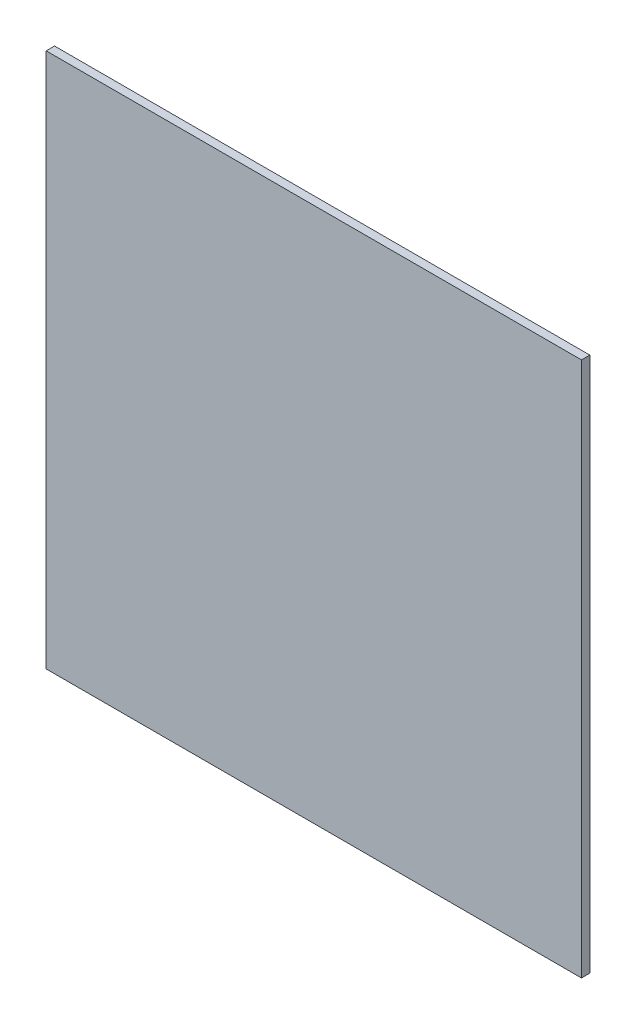
ISO-10303-21;
HEADER;
FILE_DESCRIPTION(('STEP AP214'),'2;1');
FILE_NAME('part.step','',(''),(''),'','','');
FILE_SCHEMA(('AUTOMOTIVE_DESIGN { 1 0 10303 214 1 1 1 1 }'));
ENDSEC;
DATA;
#1=APPLICATION_CONTEXT('core data for automotive mechanical design processes');
#2=APPLICATION_PROTOCOL_DEFINITION('international standard','automotive_design',2000,#1);
#3=PRODUCT_CONTEXT('',#1,'mechanical');
#4=PRODUCT('Part','Part','',(#3));
#5=PRODUCT_RELATED_PRODUCT_CATEGORY('part','',(#4));
#6=PRODUCT_DEFINITION_FORMATION('','',#4);
#7=PRODUCT_DEFINITION_CONTEXT('part definition',#1,'design');
#8=PRODUCT_DEFINITION('design','',#6,#7);
#9=PRODUCT_DEFINITION_SHAPE('','',#8);
#10=(LENGTH_UNIT() NAMED_UNIT(*) SI_UNIT(.MILLI.,.METRE.));
#11=(NAMED_UNIT(*) PLANE_ANGLE_UNIT() SI_UNIT($,.RADIAN.));
#12=(NAMED_UNIT(*) SI_UNIT($,.STERADIAN.) SOLID_ANGLE_UNIT());
#13=UNCERTAINTY_MEASURE_WITH_UNIT(LENGTH_MEASURE(1.E-05),#10,'distance_accuracy_value','');
#14=(GEOMETRIC_REPRESENTATION_CONTEXT(3) GLOBAL_UNCERTAINTY_ASSIGNED_CONTEXT((#13)) GLOBAL_UNIT_ASSIGNED_CONTEXT((#10,
#11,#12)) REPRESENTATION_CONTEXT('',''));
#15=CARTESIAN_POINT('',(0.,0.,0.));
#16=DIRECTION('',(0.,0.,1.));
#17=DIRECTION('',(1.,0.,0.));
#18=AXIS2_PLACEMENT_3D('',#15,#16,#17);
#19=CARTESIAN_POINT('',(-609.6,609.6,0.));
#20=DIRECTION('',(-1.,0.,0.));
#21=DIRECTION('',(0.,-1.,0.));
#22=AXIS2_PLACEMENT_3D('',#19,#20,#21);
#23=PLANE('',#22);
#24=DIRECTION('',(0.,-1.,0.));
#25=VECTOR('',#24,1.);
#26=CARTESIAN_POINT('',(-609.6,609.6,19.05));
#27=LINE('',#26,#25);
#28=CARTESIAN_POINT('',(-609.6,609.6,19.05));
#29=VERTEX_POINT('',#28);
#30=CARTESIAN_POINT('',(-609.6,-609.6,19.05));
#31=VERTEX_POINT('',#30);
#32=EDGE_CURVE('E106',#29,#31,#27,.T.);
#33=ORIENTED_EDGE('',*,*,#32,.F.);
#34=DIRECTION('',(0.,0.,1.));
#35=VECTOR('',#34,1.);
#36=CARTESIAN_POINT('',(-609.6,609.6,0.));
#37=LINE('',#36,#35);
#38=CARTESIAN_POINT('',(-609.6,609.6,0.));
#39=VERTEX_POINT('',#38);
#40=EDGE_CURVE('E12',#39,#29,#37,.T.);
#41=ORIENTED_EDGE('',*,*,#40,.F.);
#42=DIRECTION('',(0.,-1.,0.));
#43=VECTOR('',#42,1.);
#44=CARTESIAN_POINT('',(-609.6,609.6,0.));
#45=LINE('',#44,#43);
#46=CARTESIAN_POINT('',(-609.6,-609.6,0.));
#47=VERTEX_POINT('',#46);
#48=EDGE_CURVE('E100',#39,#47,#45,.T.);
#49=ORIENTED_EDGE('',*,*,#48,.T.);
#50=DIRECTION('',(0.,0.,1.));
#51=VECTOR('',#50,1.);
#52=CARTESIAN_POINT('',(-609.6,-609.6,0.));
#53=LINE('',#52,#51);
#54=EDGE_CURVE('E45',#47,#31,#53,.T.);
#55=ORIENTED_EDGE('',*,*,#54,.T.);
#56=EDGE_LOOP('',(#33,#41,#49,#55));
#57=FACE_BOUND('',#56,.T.);
#58=ADVANCED_FACE('F42',(#57),#23,.T.);
#59=CARTESIAN_POINT('',(609.6,609.6,0.));
#60=DIRECTION('',(0.,1.,0.));
#61=DIRECTION('',(-1.,0.,0.));
#62=AXIS2_PLACEMENT_3D('',#59,#60,#61);
#63=PLANE('',#62);
#64=DIRECTION('',(-1.,0.,0.));
#65=VECTOR('',#64,1.);
#66=CARTESIAN_POINT('',(609.6,609.6,19.05));
#67=LINE('',#66,#65);
#68=CARTESIAN_POINT('',(609.6,609.6,19.05));
#69=VERTEX_POINT('',#68);
#70=EDGE_CURVE('E102',#69,#29,#67,.T.);
#71=ORIENTED_EDGE('',*,*,#70,.F.);
#72=DIRECTION('',(0.,0.,1.));
#73=VECTOR('',#72,1.);
#74=CARTESIAN_POINT('',(609.6,609.6,0.));
#75=LINE('',#74,#73);
#76=CARTESIAN_POINT('',(609.6,609.6,0.));
#77=VERTEX_POINT('',#76);
#78=EDGE_CURVE('E51',#77,#69,#75,.T.);
#79=ORIENTED_EDGE('',*,*,#78,.F.);
#80=DIRECTION('',(-1.,0.,0.));
#81=VECTOR('',#80,1.);
#82=CARTESIAN_POINT('',(609.6,609.6,0.));
#83=LINE('',#82,#81);
#84=EDGE_CURVE('E97',#77,#39,#83,.T.);
#85=ORIENTED_EDGE('',*,*,#84,.T.);
#86=ORIENTED_EDGE('',*,*,#40,.T.);
#87=EDGE_LOOP('',(#71,#79,#85,#86));
#88=FACE_BOUND('',#87,.T.);
#89=ADVANCED_FACE('F116',(#88),#63,.T.);
#90=CARTESIAN_POINT('',(609.6,609.6,0.));
#91=DIRECTION('',(1.,0.,0.));
#92=DIRECTION('',(0.,1.,0.));
#93=AXIS2_PLACEMENT_3D('',#90,#91,#92);
#94=PLANE('',#93);
#95=DIRECTION('',(0.,1.,0.));
#96=VECTOR('',#95,1.);
#97=CARTESIAN_POINT('',(609.6,609.6,19.05));
#98=LINE('',#97,#96);
#99=CARTESIAN_POINT('',(609.6,-609.6,19.05));
#100=VERTEX_POINT('',#99);
#101=EDGE_CURVE('E92',#100,#69,#98,.T.);
#102=ORIENTED_EDGE('',*,*,#101,.F.);
#103=DIRECTION('',(0.,0.,1.));
#104=VECTOR('',#103,1.);
#105=CARTESIAN_POINT('',(609.6,-609.6,0.));
#106=LINE('',#105,#104);
#107=CARTESIAN_POINT('',(609.6,-609.6,0.));
#108=VERTEX_POINT('',#107);
#109=EDGE_CURVE('E87',#108,#100,#106,.T.);
#110=ORIENTED_EDGE('',*,*,#109,.F.);
#111=DIRECTION('',(0.,1.,0.));
#112=VECTOR('',#111,1.);
#113=CARTESIAN_POINT('',(609.6,609.6,0.));
#114=LINE('',#113,#112);
#115=EDGE_CURVE('E90',#108,#77,#114,.T.);
#116=ORIENTED_EDGE('',*,*,#115,.T.);
#117=ORIENTED_EDGE('',*,*,#78,.T.);
#118=EDGE_LOOP('',(#102,#110,#116,#117));
#119=FACE_BOUND('',#118,.T.);
#120=ADVANCED_FACE('F89',(#119),#94,.T.);
#121=CARTESIAN_POINT('',(609.6,-609.6,0.));
#122=DIRECTION('',(0.,-1.,0.));
#123=DIRECTION('',(0.,0.,-1.));
#124=AXIS2_PLACEMENT_3D('',#121,#122,#123);
#125=PLANE('',#124);
#126=DIRECTION('',(1.,0.,0.));
#127=VECTOR('',#126,1.);
#128=CARTESIAN_POINT('',(609.6,-609.6,19.05));
#129=LINE('',#128,#127);
#130=EDGE_CURVE('E109',#31,#100,#129,.T.);
#131=ORIENTED_EDGE('',*,*,#130,.F.);
#132=ORIENTED_EDGE('',*,*,#54,.F.);
#133=DIRECTION('',(1.,0.,0.));
#134=VECTOR('',#133,1.);
#135=CARTESIAN_POINT('',(609.6,-609.6,0.));
#136=LINE('',#135,#134);
#137=EDGE_CURVE('E96',#47,#108,#136,.T.);
#138=ORIENTED_EDGE('',*,*,#137,.T.);
#139=ORIENTED_EDGE('',*,*,#109,.T.);
#140=EDGE_LOOP('',(#131,#132,#138,#139));
#141=FACE_BOUND('',#140,.T.);
#142=ADVANCED_FACE('F99',(#141),#125,.T.);
#143=CARTESIAN_POINT('',(0.,0.,0.));
#144=DIRECTION('',(0.,0.,-1.));
#145=DIRECTION('',(-1.,0.,0.));
#146=AXIS2_PLACEMENT_3D('',#143,#144,#145);
#147=PLANE('',#146);
#148=ORIENTED_EDGE('',*,*,#48,.F.);
#149=ORIENTED_EDGE('',*,*,#84,.F.);
#150=ORIENTED_EDGE('',*,*,#115,.F.);
#151=ORIENTED_EDGE('',*,*,#137,.F.);
#152=EDGE_LOOP('',(#148,#149,#150,#151));
#153=FACE_BOUND('',#152,.T.);
#154=ADVANCED_FACE('F95',(#153),#147,.T.);
#155=CARTESIAN_POINT('',(0.,0.,19.05));
#156=DIRECTION('',(0.,0.,-1.));
#157=DIRECTION('',(-1.,0.,0.));
#158=AXIS2_PLACEMENT_3D('',#155,#156,#157);
#159=PLANE('',#158);
#160=ORIENTED_EDGE('',*,*,#32,.T.);
#161=ORIENTED_EDGE('',*,*,#130,.T.);
#162=ORIENTED_EDGE('',*,*,#101,.T.);
#163=ORIENTED_EDGE('',*,*,#70,.T.);
#164=EDGE_LOOP('',(#160,#161,#162,#163));
#165=FACE_BOUND('',#164,.T.);
#166=ADVANCED_FACE('F115',(#165),#159,.F.);
#167=CLOSED_SHELL('',(#58,#89,#120,#142,#154,#166));
#168=MANIFOLD_SOLID_BREP('B2',#167);
#169=CARTESIAN_POINT('',(0.,0.,19.05));
#170=DIRECTION('',(0.,0.,1.));
#171=DIRECTION('',(1.,0.,0.));
#172=AXIS2_PLACEMENT_3D('',#169,#170,#171);
#173=PLANE('',#172);
#174=CARTESIAN_POINT('',(0.,0.,19.05));
#175=DIRECTION('',(0.,0.,1.));
#176=DIRECTION('',(1.,0.,0.));
#177=AXIS2_PLACEMENT_3D('',#174,#175,#176);
#178=CIRCLE('',#177,584.2);
#179=CARTESIAN_POINT('',(-584.2,0.,19.05));
#180=VERTEX_POINT('',#179);
#181=EDGE_CURVE('E41',#180,#180,#178,.T.);
#182=ORIENTED_EDGE('',*,*,#181,.T.);
#183=EDGE_LOOP('',(#182));
#184=FACE_BOUND('',#183,.T.);
#185=CARTESIAN_POINT('',(0.,0.,19.05));
#186=DIRECTION('',(0.,0.,1.));
#187=DIRECTION('',(1.,0.,0.));
#188=AXIS2_PLACEMENT_3D('',#185,#186,#187);
#189=CIRCLE('',#188,533.4);
#190=CARTESIAN_POINT('',(-533.4,0.,19.05));
#191=VERTEX_POINT('',#190);
#192=EDGE_CURVE('E176',#191,#191,#189,.T.);
#193=ORIENTED_EDGE('',*,*,#192,.F.);
#194=EDGE_LOOP('',(#193));
#195=FACE_BOUND('',#194,.T.);
#196=ADVANCED_FACE('F165',(#184,#195),#173,.T.);
#197=CARTESIAN_POINT('',(0.,0.,0.));
#198=DIRECTION('',(0.,0.,1.));
#199=DIRECTION('',(1.,0.,0.));
#200=AXIS2_PLACEMENT_3D('',#197,#198,#199);
#201=PLANE('',#200);
#202=CARTESIAN_POINT('',(0.,0.,0.));
#203=DIRECTION('',(0.,0.,1.));
#204=DIRECTION('',(1.,0.,0.));
#205=AXIS2_PLACEMENT_3D('',#202,#203,#204);
#206=CIRCLE('',#205,584.2);
#207=CARTESIAN_POINT('',(-584.2,0.,0.));
#208=VERTEX_POINT('',#207);
#209=EDGE_CURVE('E169',#208,#208,#206,.T.);
#210=ORIENTED_EDGE('',*,*,#209,.F.);
#211=EDGE_LOOP('',(#210));
#212=FACE_BOUND('',#211,.T.);
#213=CARTESIAN_POINT('',(0.,0.,0.));
#214=DIRECTION('',(0.,0.,1.));
#215=DIRECTION('',(1.,0.,0.));
#216=AXIS2_PLACEMENT_3D('',#213,#214,#215);
#217=CIRCLE('',#216,533.4);
#218=CARTESIAN_POINT('',(-533.4,0.,0.));
#219=VERTEX_POINT('',#218);
#220=EDGE_CURVE('E178',#219,#219,#217,.T.);
#221=ORIENTED_EDGE('',*,*,#220,.T.);
#222=EDGE_LOOP('',(#221));
#223=FACE_BOUND('',#222,.T.);
#224=ADVANCED_FACE('F188',(#212,#223),#201,.F.);
#225=CARTESIAN_POINT('',(0.,0.,19.05));
#226=DIRECTION('',(0.,0.,-1.));
#227=DIRECTION('',(-1.,0.,0.));
#228=AXIS2_PLACEMENT_3D('',#225,#226,#227);
#229=CYLINDRICAL_SURFACE('',#228,584.2);
#230=CARTESIAN_POINT('',(-584.2,0.,19.05));
#231=CARTESIAN_POINT('',(-584.2,0.,18.8515625));
#232=CARTESIAN_POINT('',(-584.2,0.,18.653125));
#233=CARTESIAN_POINT('',(-584.2,0.,18.25625));
#234=CARTESIAN_POINT('',(-584.2,0.,18.0578125));
#235=CARTESIAN_POINT('',(-584.2,0.,17.6609375));
#236=CARTESIAN_POINT('',(-584.2,0.,17.4625));
#237=CARTESIAN_POINT('',(-584.2,0.,17.065625));
#238=CARTESIAN_POINT('',(-584.2,0.,16.8671875));
#239=CARTESIAN_POINT('',(-584.2,0.,16.4703125));
#240=CARTESIAN_POINT('',(-584.2,0.,16.271875));
#241=CARTESIAN_POINT('',(-584.2,0.,15.875));
#242=CARTESIAN_POINT('',(-584.2,0.,15.6765625));
#243=CARTESIAN_POINT('',(-584.2,0.,15.2796875));
#244=CARTESIAN_POINT('',(-584.2,0.,15.08125));
#245=CARTESIAN_POINT('',(-584.2,0.,14.684375));
#246=CARTESIAN_POINT('',(-584.2,0.,14.4859375));
#247=CARTESIAN_POINT('',(-584.2,0.,14.0890625));
#248=CARTESIAN_POINT('',(-584.2,0.,13.890625));
#249=CARTESIAN_POINT('',(-584.2,0.,13.49375));
#250=CARTESIAN_POINT('',(-584.2,0.,13.2953125));
#251=CARTESIAN_POINT('',(-584.2,0.,12.8984375));
#252=CARTESIAN_POINT('',(-584.2,0.,12.7));
#253=CARTESIAN_POINT('',(-584.2,0.,12.303125));
#254=CARTESIAN_POINT('',(-584.2,0.,12.1046875));
#255=CARTESIAN_POINT('',(-584.2,0.,11.7078125));
#256=CARTESIAN_POINT('',(-584.2,0.,11.509375));
#257=CARTESIAN_POINT('',(-584.2,0.,11.1125));
#258=CARTESIAN_POINT('',(-584.2,0.,10.9140625));
#259=CARTESIAN_POINT('',(-584.2,0.,10.5171875));
#260=CARTESIAN_POINT('',(-584.2,0.,10.31875));
#261=CARTESIAN_POINT('',(-584.2,0.,9.921875));
#262=CARTESIAN_POINT('',(-584.2,0.,9.7234375));
#263=CARTESIAN_POINT('',(-584.2,0.,9.3265625));
#264=CARTESIAN_POINT('',(-584.2,0.,9.128125));
#265=CARTESIAN_POINT('',(-584.2,0.,8.73125));
#266=CARTESIAN_POINT('',(-584.2,0.,8.5328125));
#267=CARTESIAN_POINT('',(-584.2,0.,8.1359375));
#268=CARTESIAN_POINT('',(-584.2,0.,7.9375));
#269=CARTESIAN_POINT('',(-584.2,0.,7.540625));
#270=CARTESIAN_POINT('',(-584.2,0.,7.3421875));
#271=CARTESIAN_POINT('',(-584.2,0.,6.9453125));
#272=CARTESIAN_POINT('',(-584.2,0.,6.746875));
#273=CARTESIAN_POINT('',(-584.2,0.,6.35));
#274=CARTESIAN_POINT('',(-584.2,0.,6.1515625));
#275=CARTESIAN_POINT('',(-584.2,0.,5.7546875));
#276=CARTESIAN_POINT('',(-584.2,0.,5.55625));
#277=CARTESIAN_POINT('',(-584.2,0.,5.159375));
#278=CARTESIAN_POINT('',(-584.2,0.,4.9609375));
#279=CARTESIAN_POINT('',(-584.2,0.,4.5640625));
#280=CARTESIAN_POINT('',(-584.2,0.,4.365625));
#281=CARTESIAN_POINT('',(-584.2,0.,3.96875));
#282=CARTESIAN_POINT('',(-584.2,0.,3.7703125));
#283=CARTESIAN_POINT('',(-584.2,0.,3.3734375));
#284=CARTESIAN_POINT('',(-584.2,0.,3.175));
#285=CARTESIAN_POINT('',(-584.2,0.,2.778125));
#286=CARTESIAN_POINT('',(-584.2,0.,2.5796875));
#287=CARTESIAN_POINT('',(-584.2,0.,2.1828125));
#288=CARTESIAN_POINT('',(-584.2,0.,1.984375));
#289=CARTESIAN_POINT('',(-584.2,0.,1.5875));
#290=CARTESIAN_POINT('',(-584.2,0.,1.3890625));
#291=CARTESIAN_POINT('',(-584.2,0.,0.992187500000001));
#292=CARTESIAN_POINT('',(-584.2,0.,0.793750000000001));
#293=CARTESIAN_POINT('',(-584.2,0.,0.396875));
#294=CARTESIAN_POINT('',(-584.2,0.,0.1984375));
#295=CARTESIAN_POINT('',(-584.2,0.,0.));
#296=B_SPLINE_CURVE_WITH_KNOTS('',3,(#230,#231,#232,#233,#234,#235,#236,#237,#238,#239,#240,
#241,#242,#243,#244,#245,#246,#247,#248,#249,#250,#251,#252,#253,#254,#255,#256,#257,#258,#259,
#260,#261,#262,#263,#264,#265,#266,#267,#268,#269,#270,#271,#272,#273,#274,#275,#276,#277,#278,
#279,#280,#281,#282,#283,#284,#285,#286,#287,#288,#289,#290,#291,#292,#293,#294,#295),
.UNSPECIFIED.,.F.,.F.,(4,2,2,2,2,2,2,2,2,2,2,2,2,2,2,2,2,2,2,2,2,2,2,2,2,2,2,2,2,2,2,2,4),(0.,
0.595312499999997,1.190625,1.7859375,2.38125,2.9765625,3.571875,4.1671875,4.7625,5.3578125,
5.953125,6.5484375,7.14375,7.7390625,8.334375,8.9296875,9.525,10.1203125,10.715625,11.3109375,
11.90625,12.5015625,13.096875,13.6921875,14.2875,14.8828125,15.478125,16.0734375,16.66875,
17.2640625,17.859375,18.4546875,19.05),.UNSPECIFIED.);
#297=EDGE_CURVE('BSEAM167',#180,#208,#296,.T.);
#298=ORIENTED_EDGE('',*,*,#181,.F.);
#299=ORIENTED_EDGE('',*,*,#209,.T.);
#300=ORIENTED_EDGE('',*,*,#297,.T.);
#301=ORIENTED_EDGE('',*,*,#297,.F.);
#302=EDGE_LOOP('',(#298,#300,#299,#301));
#303=FACE_BOUND('',#302,.T.);
#304=ADVANCED_FACE('F167',(#303),#229,.T.);
#305=CARTESIAN_POINT('',(0.,0.,19.05));
#306=DIRECTION('',(0.,0.,-1.));
#307=DIRECTION('',(-1.,0.,0.));
#308=AXIS2_PLACEMENT_3D('',#305,#306,#307);
#309=CYLINDRICAL_SURFACE('',#308,533.4);
#310=CARTESIAN_POINT('',(-533.4,0.,19.05));
#311=CARTESIAN_POINT('',(-533.4,0.,18.8515625));
#312=CARTESIAN_POINT('',(-533.4,0.,18.653125));
#313=CARTESIAN_POINT('',(-533.4,0.,18.25625));
#314=CARTESIAN_POINT('',(-533.4,0.,18.0578125));
#315=CARTESIAN_POINT('',(-533.4,0.,17.6609375));
#316=CARTESIAN_POINT('',(-533.4,0.,17.4625));
#317=CARTESIAN_POINT('',(-533.4,0.,17.065625));
#318=CARTESIAN_POINT('',(-533.4,0.,16.8671875));
#319=CARTESIAN_POINT('',(-533.4,0.,16.4703125));
#320=CARTESIAN_POINT('',(-533.4,0.,16.271875));
#321=CARTESIAN_POINT('',(-533.4,0.,15.875));
#322=CARTESIAN_POINT('',(-533.4,0.,15.6765625));
#323=CARTESIAN_POINT('',(-533.4,0.,15.2796875));
#324=CARTESIAN_POINT('',(-533.4,0.,15.08125));
#325=CARTESIAN_POINT('',(-533.4,0.,14.684375));
#326=CARTESIAN_POINT('',(-533.4,0.,14.4859375));
#327=CARTESIAN_POINT('',(-533.4,0.,14.0890625));
#328=CARTESIAN_POINT('',(-533.4,0.,13.890625));
#329=CARTESIAN_POINT('',(-533.4,0.,13.49375));
#330=CARTESIAN_POINT('',(-533.4,0.,13.2953125));
#331=CARTESIAN_POINT('',(-533.4,0.,12.8984375));
#332=CARTESIAN_POINT('',(-533.4,0.,12.7));
#333=CARTESIAN_POINT('',(-533.4,0.,12.303125));
#334=CARTESIAN_POINT('',(-533.4,0.,12.1046875));
#335=CARTESIAN_POINT('',(-533.4,0.,11.7078125));
#336=CARTESIAN_POINT('',(-533.4,0.,11.509375));
#337=CARTESIAN_POINT('',(-533.4,0.,11.1125));
#338=CARTESIAN_POINT('',(-533.4,0.,10.9140625));
#339=CARTESIAN_POINT('',(-533.4,0.,10.5171875));
#340=CARTESIAN_POINT('',(-533.4,0.,10.31875));
#341=CARTESIAN_POINT('',(-533.4,0.,9.921875));
#342=CARTESIAN_POINT('',(-533.4,0.,9.7234375));
#343=CARTESIAN_POINT('',(-533.4,0.,9.3265625));
#344=CARTESIAN_POINT('',(-533.4,0.,9.128125));
#345=CARTESIAN_POINT('',(-533.4,0.,8.73125));
#346=CARTESIAN_POINT('',(-533.4,0.,8.5328125));
#347=CARTESIAN_POINT('',(-533.4,0.,8.1359375));
#348=CARTESIAN_POINT('',(-533.4,0.,7.9375));
#349=CARTESIAN_POINT('',(-533.4,0.,7.540625));
#350=CARTESIAN_POINT('',(-533.4,0.,7.3421875));
#351=CARTESIAN_POINT('',(-533.4,0.,6.9453125));
#352=CARTESIAN_POINT('',(-533.4,0.,6.746875));
#353=CARTESIAN_POINT('',(-533.4,0.,6.35));
#354=CARTESIAN_POINT('',(-533.4,0.,6.1515625));
#355=CARTESIAN_POINT('',(-533.4,0.,5.7546875));
#356=CARTESIAN_POINT('',(-533.4,0.,5.55625));
#357=CARTESIAN_POINT('',(-533.4,0.,5.159375));
#358=CARTESIAN_POINT('',(-533.4,0.,4.9609375));
#359=CARTESIAN_POINT('',(-533.4,0.,4.5640625));
#360=CARTESIAN_POINT('',(-533.4,0.,4.365625));
#361=CARTESIAN_POINT('',(-533.4,0.,3.96875));
#362=CARTESIAN_POINT('',(-533.4,0.,3.7703125));
#363=CARTESIAN_POINT('',(-533.4,0.,3.3734375));
#364=CARTESIAN_POINT('',(-533.4,0.,3.175));
#365=CARTESIAN_POINT('',(-533.4,0.,2.778125));
#366=CARTESIAN_POINT('',(-533.4,0.,2.5796875));
#367=CARTESIAN_POINT('',(-533.4,0.,2.1828125));
#368=CARTESIAN_POINT('',(-533.4,0.,1.984375));
#369=CARTESIAN_POINT('',(-533.4,0.,1.5875));
#370=CARTESIAN_POINT('',(-533.4,0.,1.3890625));
#371=CARTESIAN_POINT('',(-533.4,0.,0.992187500000001));
#372=CARTESIAN_POINT('',(-533.4,0.,0.793750000000001));
#373=CARTESIAN_POINT('',(-533.4,0.,0.396875));
#374=CARTESIAN_POINT('',(-533.4,0.,0.1984375));
#375=CARTESIAN_POINT('',(-533.4,0.,0.));
#376=B_SPLINE_CURVE_WITH_KNOTS('',3,(#310,#311,#312,#313,#314,#315,#316,#317,#318,#319,#320,
#321,#322,#323,#324,#325,#326,#327,#328,#329,#330,#331,#332,#333,#334,#335,#336,#337,#338,#339,
#340,#341,#342,#343,#344,#345,#346,#347,#348,#349,#350,#351,#352,#353,#354,#355,#356,#357,#358,
#359,#360,#361,#362,#363,#364,#365,#366,#367,#368,#369,#370,#371,#372,#373,#374,#375),
.UNSPECIFIED.,.F.,.F.,(4,2,2,2,2,2,2,2,2,2,2,2,2,2,2,2,2,2,2,2,2,2,2,2,2,2,2,2,2,2,2,2,4),(0.,
0.5953125,1.190625,1.7859375,2.38125,2.9765625,3.571875,4.1671875,4.7625,5.3578125,5.953125,
6.5484375,7.14375,7.7390625,8.334375,8.9296875,9.525,10.1203125,10.715625,11.3109375,11.90625,
12.5015625,13.096875,13.6921875,14.2875,14.8828125,15.478125,16.0734375,16.66875,17.2640625,
17.859375,18.4546875,19.05),.UNSPECIFIED.);
#377=EDGE_CURVE('BSEAM184',#191,#219,#376,.T.);
#378=ORIENTED_EDGE('',*,*,#192,.T.);
#379=ORIENTED_EDGE('',*,*,#220,.F.);
#380=ORIENTED_EDGE('',*,*,#377,.T.);
#381=ORIENTED_EDGE('',*,*,#377,.F.);
#382=EDGE_LOOP('',(#378,#380,#379,#381));
#383=FACE_BOUND('',#382,.T.);
#384=ADVANCED_FACE('F184',(#383),#309,.F.);
#385=CLOSED_SHELL('',(#196,#224,#304,#384));
#386=MANIFOLD_SOLID_BREP('B6',#385);
#387=ADVANCED_BREP_SHAPE_REPRESENTATION('',(#18,#168,#386),#14);
#388=SHAPE_DEFINITION_REPRESENTATION(#9,#387);
ENDSEC;
END-ISO-10303-21;
